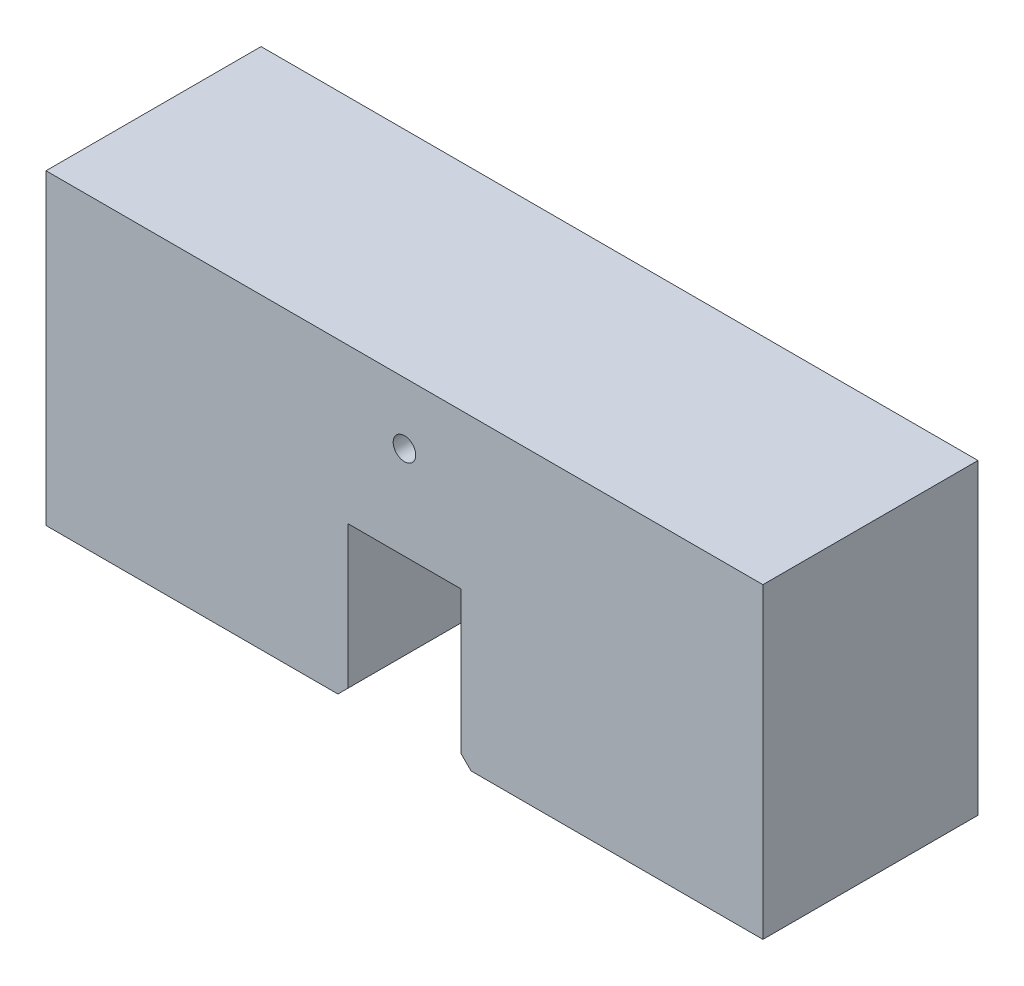
ISO-10303-21;
HEADER;
FILE_DESCRIPTION(('STEP AP214'),'2;1');
FILE_NAME('part.step','',(''),(''),'','','');
FILE_SCHEMA(('AUTOMOTIVE_DESIGN { 1 0 10303 214 1 1 1 1 }'));
ENDSEC;
DATA;
#1=APPLICATION_CONTEXT('core data for automotive mechanical design processes');
#2=APPLICATION_PROTOCOL_DEFINITION('international standard','automotive_design',2000,#1);
#3=PRODUCT_CONTEXT('',#1,'mechanical');
#4=PRODUCT('Part','Part','',(#3));
#5=PRODUCT_RELATED_PRODUCT_CATEGORY('part','',(#4));
#6=PRODUCT_DEFINITION_FORMATION('','',#4);
#7=PRODUCT_DEFINITION_CONTEXT('part definition',#1,'design');
#8=PRODUCT_DEFINITION('design','',#6,#7);
#9=PRODUCT_DEFINITION_SHAPE('','',#8);
#10=(LENGTH_UNIT() NAMED_UNIT(*) SI_UNIT(.MILLI.,.METRE.));
#11=(NAMED_UNIT(*) PLANE_ANGLE_UNIT() SI_UNIT($,.RADIAN.));
#12=(NAMED_UNIT(*) SI_UNIT($,.STERADIAN.) SOLID_ANGLE_UNIT());
#13=UNCERTAINTY_MEASURE_WITH_UNIT(LENGTH_MEASURE(1.E-05),#10,'distance_accuracy_value','');
#14=(GEOMETRIC_REPRESENTATION_CONTEXT(3) GLOBAL_UNCERTAINTY_ASSIGNED_CONTEXT((#13)) GLOBAL_UNIT_ASSIGNED_CONTEXT((#10,
#11,#12)) REPRESENTATION_CONTEXT('',''));
#15=CARTESIAN_POINT('',(0.,0.,0.));
#16=DIRECTION('',(0.,0.,1.));
#17=DIRECTION('',(1.,0.,0.));
#18=AXIS2_PLACEMENT_3D('',#15,#16,#17);
#19=CARTESIAN_POINT('',(-350.,232.421392473446,105.));
#20=DIRECTION('',(1.,0.,0.));
#21=DIRECTION('',(0.,1.,0.));
#22=AXIS2_PLACEMENT_3D('',#19,#20,#21);
#23=PLANE('',#22);
#24=DIRECTION('',(0.,-1.,0.));
#25=VECTOR('',#24,1.);
#26=CARTESIAN_POINT('',(-350.,232.421392473446,-105.));
#27=LINE('',#26,#25);
#28=CARTESIAN_POINT('',(-350.,232.421392473446,-105.));
#29=VERTEX_POINT('',#28);
#30=CARTESIAN_POINT('',(-350.,-67.5786075265541,-105.));
#31=VERTEX_POINT('',#30);
#32=EDGE_CURVE('E142',#29,#31,#27,.T.);
#33=ORIENTED_EDGE('',*,*,#32,.T.);
#34=DIRECTION('',(0.,0.,-1.));
#35=VECTOR('',#34,1.);
#36=CARTESIAN_POINT('',(-350.,-67.5786075265541,105.));
#37=LINE('',#36,#35);
#38=CARTESIAN_POINT('',(-350.,-67.5786075265541,105.));
#39=VERTEX_POINT('',#38);
#40=EDGE_CURVE('E11',#39,#31,#37,.T.);
#41=ORIENTED_EDGE('',*,*,#40,.F.);
#42=DIRECTION('',(0.,-1.,0.));
#43=VECTOR('',#42,1.);
#44=CARTESIAN_POINT('',(-350.,232.421392473446,105.));
#45=LINE('',#44,#43);
#46=CARTESIAN_POINT('',(-350.,232.421392473446,105.));
#47=VERTEX_POINT('',#46);
#48=EDGE_CURVE('E161',#47,#39,#45,.T.);
#49=ORIENTED_EDGE('',*,*,#48,.F.);
#50=DIRECTION('',(0.,0.,-1.));
#51=VECTOR('',#50,1.);
#52=CARTESIAN_POINT('',(-350.,232.421392473446,105.));
#53=LINE('',#52,#51);
#54=EDGE_CURVE('E138',#47,#29,#53,.T.);
#55=ORIENTED_EDGE('',*,*,#54,.T.);
#56=EDGE_LOOP('',(#33,#41,#49,#55));
#57=FACE_BOUND('',#56,.T.);
#58=ADVANCED_FACE('F34',(#57),#23,.F.);
#59=CARTESIAN_POINT('',(-350.,-67.5786075265541,105.));
#60=DIRECTION('',(0.,1.,0.));
#61=DIRECTION('',(-1.,0.,0.));
#62=AXIS2_PLACEMENT_3D('',#59,#60,#61);
#63=PLANE('',#62);
#64=DIRECTION('',(1.,0.,0.));
#65=VECTOR('',#64,1.);
#66=CARTESIAN_POINT('',(-350.,-67.5786075265541,-105.));
#67=LINE('',#66,#65);
#68=CARTESIAN_POINT('',(-65.,-67.5786075265541,-105.));
#69=VERTEX_POINT('',#68);
#70=EDGE_CURVE('E145',#31,#69,#67,.T.);
#71=ORIENTED_EDGE('',*,*,#70,.T.);
#72=DIRECTION('',(0.,0.,-1.));
#73=VECTOR('',#72,1.);
#74=CARTESIAN_POINT('',(-65.,-67.5786075265541,105.));
#75=LINE('',#74,#73);
#76=CARTESIAN_POINT('',(-65.,-67.5786075265541,105.));
#77=VERTEX_POINT('',#76);
#78=EDGE_CURVE('E42',#77,#69,#75,.T.);
#79=ORIENTED_EDGE('',*,*,#78,.F.);
#80=DIRECTION('',(1.,0.,0.));
#81=VECTOR('',#80,1.);
#82=CARTESIAN_POINT('',(-350.,-67.5786075265541,105.));
#83=LINE('',#82,#81);
#84=EDGE_CURVE('E99',#39,#77,#83,.T.);
#85=ORIENTED_EDGE('',*,*,#84,.F.);
#86=ORIENTED_EDGE('',*,*,#40,.T.);
#87=EDGE_LOOP('',(#71,#79,#85,#86));
#88=FACE_BOUND('',#87,.T.);
#89=ADVANCED_FACE('F228',(#88),#63,.F.);
#90=CARTESIAN_POINT('',(-65.,-67.5786075265541,105.));
#91=DIRECTION('',(-0.707106781186546,0.707106781186549,0.));
#92=DIRECTION('',(-0.707106781186549,-0.707106781186546,0.));
#93=AXIS2_PLACEMENT_3D('',#90,#91,#92);
#94=PLANE('',#93);
#95=DIRECTION('',(0.707106781186549,0.707106781186546,0.));
#96=VECTOR('',#95,1.);
#97=CARTESIAN_POINT('',(-65.,-67.5786075265541,-105.));
#98=LINE('',#97,#96);
#99=CARTESIAN_POINT('',(-55.,-57.5786075265541,-105.));
#100=VERTEX_POINT('',#99);
#101=EDGE_CURVE('E148',#69,#100,#98,.T.);
#102=ORIENTED_EDGE('',*,*,#101,.T.);
#103=DIRECTION('',(0.,0.,-1.));
#104=VECTOR('',#103,1.);
#105=CARTESIAN_POINT('',(-55.,-57.5786075265541,105.));
#106=LINE('',#105,#104);
#107=CARTESIAN_POINT('',(-55.,-57.5786075265541,105.));
#108=VERTEX_POINT('',#107);
#109=EDGE_CURVE('E174',#108,#100,#106,.T.);
#110=ORIENTED_EDGE('',*,*,#109,.F.);
#111=DIRECTION('',(0.707106781186549,0.707106781186546,0.));
#112=VECTOR('',#111,1.);
#113=CARTESIAN_POINT('',(-65.,-67.5786075265541,105.));
#114=LINE('',#113,#112);
#115=EDGE_CURVE('E182',#77,#108,#114,.T.);
#116=ORIENTED_EDGE('',*,*,#115,.F.);
#117=ORIENTED_EDGE('',*,*,#78,.T.);
#118=EDGE_LOOP('',(#102,#110,#116,#117));
#119=FACE_BOUND('',#118,.T.);
#120=ADVANCED_FACE('F180',(#119),#94,.F.);
#121=CARTESIAN_POINT('',(-55.,-57.5786075265541,105.));
#122=DIRECTION('',(-1.,0.,0.));
#123=DIRECTION('',(0.,0.,1.));
#124=AXIS2_PLACEMENT_3D('',#121,#122,#123);
#125=PLANE('',#124);
#126=DIRECTION('',(0.,1.,0.));
#127=VECTOR('',#126,1.);
#128=CARTESIAN_POINT('',(-55.,-57.5786075265541,-105.));
#129=LINE('',#128,#127);
#130=CARTESIAN_POINT('',(-55.,81.4213924734459,-105.));
#131=VERTEX_POINT('',#130);
#132=EDGE_CURVE('E150',#100,#131,#129,.T.);
#133=ORIENTED_EDGE('',*,*,#132,.T.);
#134=DIRECTION('',(0.,0.,-1.));
#135=VECTOR('',#134,1.);
#136=CARTESIAN_POINT('',(-55.,81.4213924734459,105.));
#137=LINE('',#136,#135);
#138=CARTESIAN_POINT('',(-55.,81.4213924734459,105.));
#139=VERTEX_POINT('',#138);
#140=EDGE_CURVE('E171',#139,#131,#137,.T.);
#141=ORIENTED_EDGE('',*,*,#140,.F.);
#142=DIRECTION('',(0.,1.,0.));
#143=VECTOR('',#142,1.);
#144=CARTESIAN_POINT('',(-55.,-57.5786075265541,105.));
#145=LINE('',#144,#143);
#146=EDGE_CURVE('E200',#108,#139,#145,.T.);
#147=ORIENTED_EDGE('',*,*,#146,.F.);
#148=ORIENTED_EDGE('',*,*,#109,.T.);
#149=EDGE_LOOP('',(#133,#141,#147,#148));
#150=FACE_BOUND('',#149,.T.);
#151=ADVANCED_FACE('F191',(#150),#125,.F.);
#152=CARTESIAN_POINT('',(-55.,81.4213924734459,105.));
#153=DIRECTION('',(0.,1.,0.));
#154=DIRECTION('',(0.,0.,1.));
#155=AXIS2_PLACEMENT_3D('',#152,#153,#154);
#156=PLANE('',#155);
#157=DIRECTION('',(1.,0.,0.));
#158=VECTOR('',#157,1.);
#159=CARTESIAN_POINT('',(-55.,81.4213924734459,-105.));
#160=LINE('',#159,#158);
#161=CARTESIAN_POINT('',(55.,81.4213924734459,-105.));
#162=VERTEX_POINT('',#161);
#163=EDGE_CURVE('E152',#131,#162,#160,.T.);
#164=ORIENTED_EDGE('',*,*,#163,.T.);
#165=DIRECTION('',(0.,0.,-1.));
#166=VECTOR('',#165,1.);
#167=CARTESIAN_POINT('',(55.,81.4213924734459,105.));
#168=LINE('',#167,#166);
#169=CARTESIAN_POINT('',(55.,81.4213924734459,105.));
#170=VERTEX_POINT('',#169);
#171=EDGE_CURVE('E168',#170,#162,#168,.T.);
#172=ORIENTED_EDGE('',*,*,#171,.F.);
#173=DIRECTION('',(1.,0.,0.));
#174=VECTOR('',#173,1.);
#175=CARTESIAN_POINT('',(-55.,81.4213924734459,105.));
#176=LINE('',#175,#174);
#177=EDGE_CURVE('E197',#139,#170,#176,.T.);
#178=ORIENTED_EDGE('',*,*,#177,.F.);
#179=ORIENTED_EDGE('',*,*,#140,.T.);
#180=EDGE_LOOP('',(#164,#172,#178,#179));
#181=FACE_BOUND('',#180,.T.);
#182=ADVANCED_FACE('F195',(#181),#156,.F.);
#183=CARTESIAN_POINT('',(55.,-57.5786075265541,105.));
#184=DIRECTION('',(1.,0.,0.));
#185=DIRECTION('',(0.,1.,0.));
#186=AXIS2_PLACEMENT_3D('',#183,#184,#185);
#187=PLANE('',#186);
#188=DIRECTION('',(0.,-1.,0.));
#189=VECTOR('',#188,1.);
#190=CARTESIAN_POINT('',(55.,-57.5786075265541,-105.));
#191=LINE('',#190,#189);
#192=CARTESIAN_POINT('',(55.,-57.5786075265541,-105.));
#193=VERTEX_POINT('',#192);
#194=EDGE_CURVE('E154',#162,#193,#191,.T.);
#195=ORIENTED_EDGE('',*,*,#194,.T.);
#196=DIRECTION('',(0.,0.,-1.));
#197=VECTOR('',#196,1.);
#198=CARTESIAN_POINT('',(55.,-57.5786075265541,105.));
#199=LINE('',#198,#197);
#200=CARTESIAN_POINT('',(55.,-57.5786075265541,105.));
#201=VERTEX_POINT('',#200);
#202=EDGE_CURVE('E165',#201,#193,#199,.T.);
#203=ORIENTED_EDGE('',*,*,#202,.F.);
#204=DIRECTION('',(0.,-1.,0.));
#205=VECTOR('',#204,1.);
#206=CARTESIAN_POINT('',(55.,-57.5786075265541,105.));
#207=LINE('',#206,#205);
#208=EDGE_CURVE('E199',#170,#201,#207,.T.);
#209=ORIENTED_EDGE('',*,*,#208,.F.);
#210=ORIENTED_EDGE('',*,*,#171,.T.);
#211=EDGE_LOOP('',(#195,#203,#209,#210));
#212=FACE_BOUND('',#211,.T.);
#213=ADVANCED_FACE('F240',(#212),#187,.F.);
#214=CARTESIAN_POINT('',(65.,-67.5786075265541,105.));
#215=DIRECTION('',(0.707106781186546,0.707106781186549,0.));
#216=DIRECTION('',(-0.707106781186549,0.707106781186546,0.));
#217=AXIS2_PLACEMENT_3D('',#214,#215,#216);
#218=PLANE('',#217);
#219=DIRECTION('',(0.707106781186549,-0.707106781186546,0.));
#220=VECTOR('',#219,1.);
#221=CARTESIAN_POINT('',(65.,-67.5786075265541,-105.));
#222=LINE('',#221,#220);
#223=CARTESIAN_POINT('',(65.,-67.5786075265541,-105.));
#224=VERTEX_POINT('',#223);
#225=EDGE_CURVE('E156',#193,#224,#222,.T.);
#226=ORIENTED_EDGE('',*,*,#225,.T.);
#227=DIRECTION('',(0.,0.,-1.));
#228=VECTOR('',#227,1.);
#229=CARTESIAN_POINT('',(65.,-67.5786075265541,105.));
#230=LINE('',#229,#228);
#231=CARTESIAN_POINT('',(65.,-67.5786075265541,105.));
#232=VERTEX_POINT('',#231);
#233=EDGE_CURVE('E133',#232,#224,#230,.T.);
#234=ORIENTED_EDGE('',*,*,#233,.F.);
#235=DIRECTION('',(0.707106781186549,-0.707106781186546,0.));
#236=VECTOR('',#235,1.);
#237=CARTESIAN_POINT('',(65.,-67.5786075265541,105.));
#238=LINE('',#237,#236);
#239=EDGE_CURVE('E124',#201,#232,#238,.T.);
#240=ORIENTED_EDGE('',*,*,#239,.F.);
#241=ORIENTED_EDGE('',*,*,#202,.T.);
#242=EDGE_LOOP('',(#226,#234,#240,#241));
#243=FACE_BOUND('',#242,.T.);
#244=ADVANCED_FACE('F237',(#243),#218,.F.);
#245=CARTESIAN_POINT('',(350.,-67.5786075265541,105.));
#246=DIRECTION('',(0.,1.,0.));
#247=DIRECTION('',(0.,0.,1.));
#248=AXIS2_PLACEMENT_3D('',#245,#246,#247);
#249=PLANE('',#248);
#250=DIRECTION('',(1.,0.,0.));
#251=VECTOR('',#250,1.);
#252=CARTESIAN_POINT('',(350.,-67.5786075265541,-105.));
#253=LINE('',#252,#251);
#254=CARTESIAN_POINT('',(350.,-67.5786075265541,-105.));
#255=VERTEX_POINT('',#254);
#256=EDGE_CURVE('E132',#224,#255,#253,.T.);
#257=ORIENTED_EDGE('',*,*,#256,.T.);
#258=DIRECTION('',(0.,0.,-1.));
#259=VECTOR('',#258,1.);
#260=CARTESIAN_POINT('',(350.,-67.5786075265541,105.));
#261=LINE('',#260,#259);
#262=CARTESIAN_POINT('',(350.,-67.5786075265541,105.));
#263=VERTEX_POINT('',#262);
#264=EDGE_CURVE('E129',#263,#255,#261,.T.);
#265=ORIENTED_EDGE('',*,*,#264,.F.);
#266=DIRECTION('',(1.,0.,0.));
#267=VECTOR('',#266,1.);
#268=CARTESIAN_POINT('',(350.,-67.5786075265541,105.));
#269=LINE('',#268,#267);
#270=EDGE_CURVE('E118',#232,#263,#269,.T.);
#271=ORIENTED_EDGE('',*,*,#270,.F.);
#272=ORIENTED_EDGE('',*,*,#233,.T.);
#273=EDGE_LOOP('',(#257,#265,#271,#272));
#274=FACE_BOUND('',#273,.T.);
#275=ADVANCED_FACE('F130',(#274),#249,.F.);
#276=CARTESIAN_POINT('',(350.,232.421392473446,105.));
#277=DIRECTION('',(-1.,0.,0.));
#278=DIRECTION('',(0.,-1.,0.));
#279=AXIS2_PLACEMENT_3D('',#276,#277,#278);
#280=PLANE('',#279);
#281=DIRECTION('',(0.,1.,0.));
#282=VECTOR('',#281,1.);
#283=CARTESIAN_POINT('',(350.,232.421392473446,-105.));
#284=LINE('',#283,#282);
#285=CARTESIAN_POINT('',(350.,232.421392473446,-105.));
#286=VERTEX_POINT('',#285);
#287=EDGE_CURVE('E85',#255,#286,#284,.T.);
#288=ORIENTED_EDGE('',*,*,#287,.T.);
#289=DIRECTION('',(0.,0.,-1.));
#290=VECTOR('',#289,1.);
#291=CARTESIAN_POINT('',(350.,232.421392473446,105.));
#292=LINE('',#291,#290);
#293=CARTESIAN_POINT('',(350.,232.421392473446,105.));
#294=VERTEX_POINT('',#293);
#295=EDGE_CURVE('E134',#294,#286,#292,.T.);
#296=ORIENTED_EDGE('',*,*,#295,.F.);
#297=DIRECTION('',(0.,1.,0.));
#298=VECTOR('',#297,1.);
#299=CARTESIAN_POINT('',(350.,232.421392473446,105.));
#300=LINE('',#299,#298);
#301=EDGE_CURVE('E122',#263,#294,#300,.T.);
#302=ORIENTED_EDGE('',*,*,#301,.F.);
#303=ORIENTED_EDGE('',*,*,#264,.T.);
#304=EDGE_LOOP('',(#288,#296,#302,#303));
#305=FACE_BOUND('',#304,.T.);
#306=ADVANCED_FACE('F136',(#305),#280,.F.);
#307=CARTESIAN_POINT('',(350.,232.421392473446,105.));
#308=DIRECTION('',(0.,-1.,0.));
#309=DIRECTION('',(0.,0.,-1.));
#310=AXIS2_PLACEMENT_3D('',#307,#308,#309);
#311=PLANE('',#310);
#312=DIRECTION('',(-1.,0.,0.));
#313=VECTOR('',#312,1.);
#314=CARTESIAN_POINT('',(350.,232.421392473446,-105.));
#315=LINE('',#314,#313);
#316=EDGE_CURVE('E91',#286,#29,#315,.T.);
#317=ORIENTED_EDGE('',*,*,#316,.T.);
#318=ORIENTED_EDGE('',*,*,#54,.F.);
#319=DIRECTION('',(-1.,0.,0.));
#320=VECTOR('',#319,1.);
#321=CARTESIAN_POINT('',(350.,232.421392473446,105.));
#322=LINE('',#321,#320);
#323=EDGE_CURVE('E50',#294,#47,#322,.T.);
#324=ORIENTED_EDGE('',*,*,#323,.F.);
#325=ORIENTED_EDGE('',*,*,#295,.T.);
#326=EDGE_LOOP('',(#317,#318,#324,#325));
#327=FACE_BOUND('',#326,.T.);
#328=ADVANCED_FACE('F217',(#327),#311,.F.);
#329=CARTESIAN_POINT('',(0.,0.,105.));
#330=DIRECTION('',(0.,0.,1.));
#331=DIRECTION('',(1.,0.,0.));
#332=AXIS2_PLACEMENT_3D('',#329,#330,#331);
#333=PLANE('',#332);
#334=CARTESIAN_POINT('',(0.,172.421392473446,105.));
#335=DIRECTION('',(0.,0.,1.));
#336=DIRECTION('',(1.,0.,0.));
#337=AXIS2_PLACEMENT_3D('',#334,#335,#336);
#338=CIRCLE('',#337,11.);
#339=CARTESIAN_POINT('',(11.,172.421392473446,105.));
#340=VERTEX_POINT('',#339);
#341=EDGE_CURVE('E210',#340,#340,#338,.T.);
#342=ORIENTED_EDGE('',*,*,#341,.F.);
#343=EDGE_LOOP('',(#342));
#344=FACE_BOUND('',#343,.T.);
#345=ORIENTED_EDGE('',*,*,#48,.T.);
#346=ORIENTED_EDGE('',*,*,#84,.T.);
#347=ORIENTED_EDGE('',*,*,#115,.T.);
#348=ORIENTED_EDGE('',*,*,#146,.T.);
#349=ORIENTED_EDGE('',*,*,#177,.T.);
#350=ORIENTED_EDGE('',*,*,#208,.T.);
#351=ORIENTED_EDGE('',*,*,#239,.T.);
#352=ORIENTED_EDGE('',*,*,#270,.T.);
#353=ORIENTED_EDGE('',*,*,#301,.T.);
#354=ORIENTED_EDGE('',*,*,#323,.T.);
#355=EDGE_LOOP('',(#345,#346,#347,#348,#349,#350,#351,#352,#353,#354));
#356=FACE_BOUND('',#355,.T.);
#357=ADVANCED_FACE('F120',(#344,#356),#333,.T.);
#358=CARTESIAN_POINT('',(0.,0.,-105.));
#359=DIRECTION('',(0.,0.,1.));
#360=DIRECTION('',(1.,0.,0.));
#361=AXIS2_PLACEMENT_3D('',#358,#359,#360);
#362=PLANE('',#361);
#363=CARTESIAN_POINT('',(0.,172.421392473446,-105.));
#364=DIRECTION('',(0.,0.,1.));
#365=DIRECTION('',(1.,0.,0.));
#366=AXIS2_PLACEMENT_3D('',#363,#364,#365);
#367=CIRCLE('',#366,11.);
#368=CARTESIAN_POINT('',(11.,172.421392473446,-105.));
#369=VERTEX_POINT('',#368);
#370=EDGE_CURVE('E146',#369,#369,#367,.T.);
#371=ORIENTED_EDGE('',*,*,#370,.T.);
#372=EDGE_LOOP('',(#371));
#373=FACE_BOUND('',#372,.T.);
#374=ORIENTED_EDGE('',*,*,#32,.F.);
#375=ORIENTED_EDGE('',*,*,#316,.F.);
#376=ORIENTED_EDGE('',*,*,#287,.F.);
#377=ORIENTED_EDGE('',*,*,#256,.F.);
#378=ORIENTED_EDGE('',*,*,#225,.F.);
#379=ORIENTED_EDGE('',*,*,#194,.F.);
#380=ORIENTED_EDGE('',*,*,#163,.F.);
#381=ORIENTED_EDGE('',*,*,#132,.F.);
#382=ORIENTED_EDGE('',*,*,#101,.F.);
#383=ORIENTED_EDGE('',*,*,#70,.F.);
#384=EDGE_LOOP('',(#374,#375,#376,#377,#378,#379,#380,#381,#382,#383));
#385=FACE_BOUND('',#384,.T.);
#386=ADVANCED_FACE('F186',(#373,#385),#362,.F.);
#387=CARTESIAN_POINT('',(0.,172.421392473446,-105.));
#388=DIRECTION('',(0.,0.,1.));
#389=DIRECTION('',(1.,0.,0.));
#390=AXIS2_PLACEMENT_3D('',#387,#388,#389);
#391=CYLINDRICAL_SURFACE('',#390,11.);
#392=ORIENTED_EDGE('',*,*,#370,.F.);
#393=EDGE_LOOP('',(#392));
#394=FACE_BOUND('',#393,.T.);
#395=ORIENTED_EDGE('',*,*,#341,.T.);
#396=EDGE_LOOP('',(#395));
#397=FACE_BOUND('',#396,.T.);
#398=ADVANCED_FACE('F214',(#394,#397),#391,.F.);
#399=CLOSED_SHELL('',(#58,#89,#120,#151,#182,#213,#244,#275,#306,#328,#357,#386,#398));
#400=MANIFOLD_SOLID_BREP('B2',#399);
#401=ADVANCED_BREP_SHAPE_REPRESENTATION('',(#18,#400),#14);
#402=SHAPE_DEFINITION_REPRESENTATION(#9,#401);
ENDSEC;
END-ISO-10303-21;
